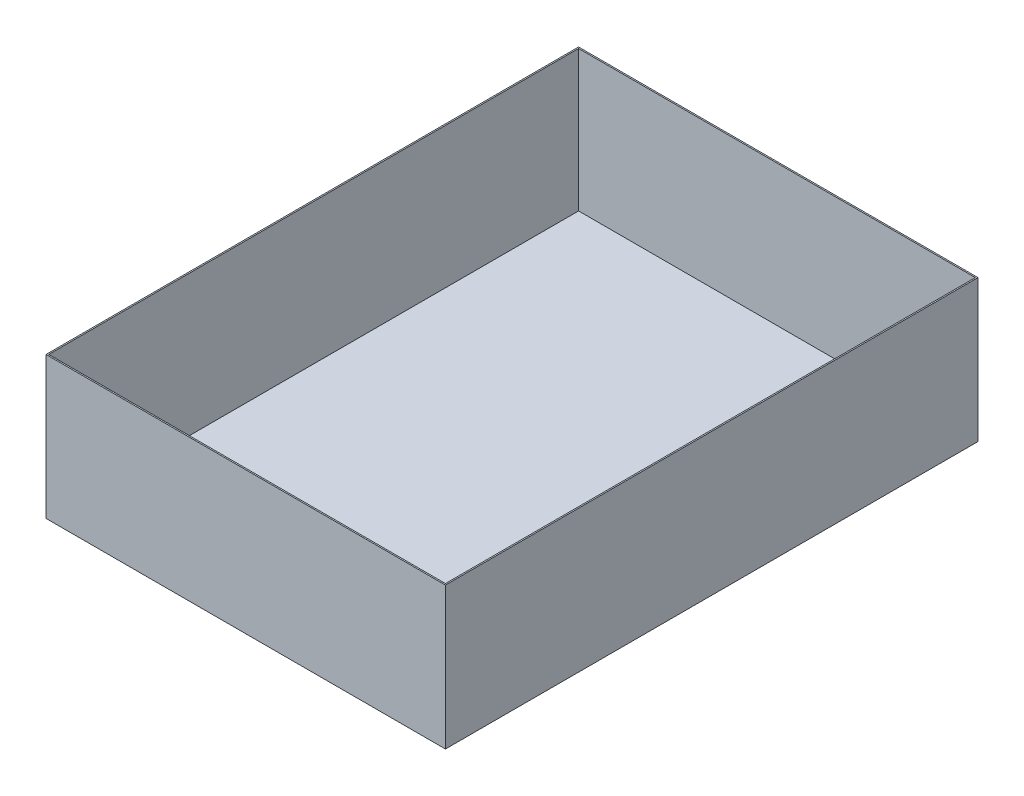
ISO-10303-21;
HEADER;
FILE_DESCRIPTION(('STEP AP214'),'2;1');
FILE_NAME('part.step','',(''),(''),'','','');
FILE_SCHEMA(('AUTOMOTIVE_DESIGN { 1 0 10303 214 1 1 1 1 }'));
ENDSEC;
DATA;
#1=APPLICATION_CONTEXT('core data for automotive mechanical design processes');
#2=APPLICATION_PROTOCOL_DEFINITION('international standard','automotive_design',2000,#1);
#3=PRODUCT_CONTEXT('',#1,'mechanical');
#4=PRODUCT('Part','Part','',(#3));
#5=PRODUCT_RELATED_PRODUCT_CATEGORY('part','',(#4));
#6=PRODUCT_DEFINITION_FORMATION('','',#4);
#7=PRODUCT_DEFINITION_CONTEXT('part definition',#1,'design');
#8=PRODUCT_DEFINITION('design','',#6,#7);
#9=PRODUCT_DEFINITION_SHAPE('','',#8);
#10=(LENGTH_UNIT() NAMED_UNIT(*) SI_UNIT(.MILLI.,.METRE.));
#11=(NAMED_UNIT(*) PLANE_ANGLE_UNIT() SI_UNIT($,.RADIAN.));
#12=(NAMED_UNIT(*) SI_UNIT($,.STERADIAN.) SOLID_ANGLE_UNIT());
#13=UNCERTAINTY_MEASURE_WITH_UNIT(LENGTH_MEASURE(1.E-05),#10,'distance_accuracy_value','');
#14=(GEOMETRIC_REPRESENTATION_CONTEXT(3) GLOBAL_UNCERTAINTY_ASSIGNED_CONTEXT((#13)) GLOBAL_UNIT_ASSIGNED_CONTEXT((#10,
#11,#12)) REPRESENTATION_CONTEXT('',''));
#15=CARTESIAN_POINT('',(0.,0.,0.));
#16=DIRECTION('',(0.,0.,1.));
#17=DIRECTION('',(1.,0.,0.));
#18=AXIS2_PLACEMENT_3D('',#15,#16,#17);
#19=CARTESIAN_POINT('',(0.,160.,0.));
#20=DIRECTION('',(1.,0.,0.));
#21=DIRECTION('',(0.,0.,-1.));
#22=AXIS2_PLACEMENT_3D('',#19,#20,#21);
#23=PLANE('',#22);
#24=DIRECTION('',(0.,0.,1.));
#25=VECTOR('',#24,1.);
#26=CARTESIAN_POINT('',(0.,0.,0.));
#27=LINE('',#26,#25);
#28=CARTESIAN_POINT('',(0.,0.,-600.));
#29=VERTEX_POINT('',#28);
#30=CARTESIAN_POINT('',(0.,0.,0.));
#31=VERTEX_POINT('',#30);
#32=EDGE_CURVE('E162',#29,#31,#27,.T.);
#33=ORIENTED_EDGE('',*,*,#32,.T.);
#34=DIRECTION('',(0.,-1.,0.));
#35=VECTOR('',#34,1.);
#36=CARTESIAN_POINT('',(0.,160.,0.));
#37=LINE('',#36,#35);
#38=CARTESIAN_POINT('',(0.,160.,0.));
#39=VERTEX_POINT('',#38);
#40=EDGE_CURVE('E12',#39,#31,#37,.T.);
#41=ORIENTED_EDGE('',*,*,#40,.F.);
#42=DIRECTION('',(0.,0.,1.));
#43=VECTOR('',#42,1.);
#44=CARTESIAN_POINT('',(0.,160.,0.));
#45=LINE('',#44,#43);
#46=CARTESIAN_POINT('',(0.,160.,-600.));
#47=VERTEX_POINT('',#46);
#48=EDGE_CURVE('E163',#47,#39,#45,.T.);
#49=ORIENTED_EDGE('',*,*,#48,.F.);
#50=DIRECTION('',(0.,-1.,0.));
#51=VECTOR('',#50,1.);
#52=CARTESIAN_POINT('',(0.,160.,-600.));
#53=LINE('',#52,#51);
#54=EDGE_CURVE('E173',#47,#29,#53,.T.);
#55=ORIENTED_EDGE('',*,*,#54,.T.);
#56=EDGE_LOOP('',(#33,#41,#49,#55));
#57=FACE_BOUND('',#56,.T.);
#58=ADVANCED_FACE('F41',(#57),#23,.F.);
#59=CARTESIAN_POINT('',(0.,160.,0.));
#60=DIRECTION('',(0.,0.,-1.));
#61=DIRECTION('',(-1.,0.,0.));
#62=AXIS2_PLACEMENT_3D('',#59,#60,#61);
#63=PLANE('',#62);
#64=DIRECTION('',(1.,0.,0.));
#65=VECTOR('',#64,1.);
#66=CARTESIAN_POINT('',(0.,0.,0.));
#67=LINE('',#66,#65);
#68=CARTESIAN_POINT('',(450.,0.,0.));
#69=VERTEX_POINT('',#68);
#70=EDGE_CURVE('E177',#31,#69,#67,.T.);
#71=ORIENTED_EDGE('',*,*,#70,.T.);
#72=DIRECTION('',(0.,-1.,0.));
#73=VECTOR('',#72,1.);
#74=CARTESIAN_POINT('',(450.,160.,0.));
#75=LINE('',#74,#73);
#76=CARTESIAN_POINT('',(450.,160.,0.));
#77=VERTEX_POINT('',#76);
#78=EDGE_CURVE('E49',#77,#69,#75,.T.);
#79=ORIENTED_EDGE('',*,*,#78,.F.);
#80=DIRECTION('',(1.,0.,0.));
#81=VECTOR('',#80,1.);
#82=CARTESIAN_POINT('',(0.,160.,0.));
#83=LINE('',#82,#81);
#84=EDGE_CURVE('E93',#39,#77,#83,.T.);
#85=ORIENTED_EDGE('',*,*,#84,.F.);
#86=ORIENTED_EDGE('',*,*,#40,.T.);
#87=EDGE_LOOP('',(#71,#79,#85,#86));
#88=FACE_BOUND('',#87,.T.);
#89=ADVANCED_FACE('F212',(#88),#63,.F.);
#90=CARTESIAN_POINT('',(450.,160.,0.));
#91=DIRECTION('',(-1.,0.,0.));
#92=DIRECTION('',(0.,0.,1.));
#93=AXIS2_PLACEMENT_3D('',#90,#91,#92);
#94=PLANE('',#93);
#95=DIRECTION('',(0.,0.,-1.));
#96=VECTOR('',#95,1.);
#97=CARTESIAN_POINT('',(450.,0.,0.));
#98=LINE('',#97,#96);
#99=CARTESIAN_POINT('',(450.,0.,-600.));
#100=VERTEX_POINT('',#99);
#101=EDGE_CURVE('E180',#69,#100,#98,.T.);
#102=ORIENTED_EDGE('',*,*,#101,.T.);
#103=DIRECTION('',(0.,-1.,0.));
#104=VECTOR('',#103,1.);
#105=CARTESIAN_POINT('',(450.,160.,-600.));
#106=LINE('',#105,#104);
#107=CARTESIAN_POINT('',(450.,160.,-600.));
#108=VERTEX_POINT('',#107);
#109=EDGE_CURVE('E187',#108,#100,#106,.T.);
#110=ORIENTED_EDGE('',*,*,#109,.F.);
#111=DIRECTION('',(0.,0.,-1.));
#112=VECTOR('',#111,1.);
#113=CARTESIAN_POINT('',(450.,160.,0.));
#114=LINE('',#113,#112);
#115=EDGE_CURVE('E168',#77,#108,#114,.T.);
#116=ORIENTED_EDGE('',*,*,#115,.F.);
#117=ORIENTED_EDGE('',*,*,#78,.T.);
#118=EDGE_LOOP('',(#102,#110,#116,#117));
#119=FACE_BOUND('',#118,.T.);
#120=ADVANCED_FACE('F194',(#119),#94,.F.);
#121=CARTESIAN_POINT('',(0.,160.,-600.));
#122=DIRECTION('',(0.,0.,1.));
#123=DIRECTION('',(1.,0.,0.));
#124=AXIS2_PLACEMENT_3D('',#121,#122,#123);
#125=PLANE('',#124);
#126=DIRECTION('',(-1.,0.,0.));
#127=VECTOR('',#126,1.);
#128=CARTESIAN_POINT('',(0.,0.,-600.));
#129=LINE('',#128,#127);
#130=EDGE_CURVE('E86',#100,#29,#129,.T.);
#131=ORIENTED_EDGE('',*,*,#130,.T.);
#132=ORIENTED_EDGE('',*,*,#54,.F.);
#133=DIRECTION('',(-1.,0.,0.));
#134=VECTOR('',#133,1.);
#135=CARTESIAN_POINT('',(0.,160.,-600.));
#136=LINE('',#135,#134);
#137=EDGE_CURVE('E65',#108,#47,#136,.T.);
#138=ORIENTED_EDGE('',*,*,#137,.F.);
#139=ORIENTED_EDGE('',*,*,#109,.T.);
#140=EDGE_LOOP('',(#131,#132,#138,#139));
#141=FACE_BOUND('',#140,.T.);
#142=ADVANCED_FACE('F202',(#141),#125,.F.);
#143=CARTESIAN_POINT('',(0.,160.,0.));
#144=DIRECTION('',(0.,-1.,0.));
#145=DIRECTION('',(0.,0.,-1.));
#146=AXIS2_PLACEMENT_3D('',#143,#144,#145);
#147=PLANE('',#146);
#148=DIRECTION('',(0.,0.,1.));
#149=VECTOR('',#148,1.);
#150=CARTESIAN_POINT('',(1.50000000000007,160.,0.));
#151=LINE('',#150,#149);
#152=CARTESIAN_POINT('',(1.5,160.,-598.5));
#153=VERTEX_POINT('',#152);
#154=CARTESIAN_POINT('',(1.50000000000007,160.,-1.5));
#155=VERTEX_POINT('',#154);
#156=EDGE_CURVE('E143',#153,#155,#151,.T.);
#157=ORIENTED_EDGE('',*,*,#156,.F.);
#158=DIRECTION('',(-1.,0.,0.));
#159=VECTOR('',#158,1.);
#160=CARTESIAN_POINT('',(-1.48650666719945E-13,160.,-598.5));
#161=LINE('',#160,#159);
#162=CARTESIAN_POINT('',(448.5,160.,-598.5));
#163=VERTEX_POINT('',#162);
#164=EDGE_CURVE('E133',#163,#153,#161,.T.);
#165=ORIENTED_EDGE('',*,*,#164,.F.);
#166=DIRECTION('',(0.,0.,-1.));
#167=VECTOR('',#166,1.);
#168=CARTESIAN_POINT('',(448.5,160.,0.));
#169=LINE('',#168,#167);
#170=CARTESIAN_POINT('',(448.5,160.,-1.50000000000002));
#171=VERTEX_POINT('',#170);
#172=EDGE_CURVE('E147',#171,#163,#169,.T.);
#173=ORIENTED_EDGE('',*,*,#172,.F.);
#174=DIRECTION('',(1.,0.,0.));
#175=VECTOR('',#174,1.);
#176=CARTESIAN_POINT('',(0.,160.,-1.5));
#177=LINE('',#176,#175);
#178=EDGE_CURVE('E56',#155,#171,#177,.T.);
#179=ORIENTED_EDGE('',*,*,#178,.F.);
#180=EDGE_LOOP('',(#157,#165,#173,#179));
#181=FACE_BOUND('',#180,.T.);
#182=ORIENTED_EDGE('',*,*,#48,.T.);
#183=ORIENTED_EDGE('',*,*,#84,.T.);
#184=ORIENTED_EDGE('',*,*,#115,.T.);
#185=ORIENTED_EDGE('',*,*,#137,.T.);
#186=EDGE_LOOP('',(#182,#183,#184,#185));
#187=FACE_BOUND('',#186,.T.);
#188=ADVANCED_FACE('F204',(#181,#187),#147,.F.);
#189=CARTESIAN_POINT('',(0.,0.,0.));
#190=DIRECTION('',(0.,-1.,0.));
#191=DIRECTION('',(0.,0.,-1.));
#192=AXIS2_PLACEMENT_3D('',#189,#190,#191);
#193=PLANE('',#192);
#194=ORIENTED_EDGE('',*,*,#32,.F.);
#195=ORIENTED_EDGE('',*,*,#130,.F.);
#196=ORIENTED_EDGE('',*,*,#101,.F.);
#197=ORIENTED_EDGE('',*,*,#70,.F.);
#198=EDGE_LOOP('',(#194,#195,#196,#197));
#199=FACE_BOUND('',#198,.T.);
#200=ADVANCED_FACE('F198',(#199),#193,.T.);
#201=CARTESIAN_POINT('',(0.,1.5,0.));
#202=DIRECTION('',(0.,-1.,0.));
#203=DIRECTION('',(0.,0.,-1.));
#204=AXIS2_PLACEMENT_3D('',#201,#202,#203);
#205=PLANE('',#204);
#206=DIRECTION('',(0.,0.,-1.));
#207=VECTOR('',#206,1.);
#208=CARTESIAN_POINT('',(448.5,1.49999999999995,0.));
#209=LINE('',#208,#207);
#210=CARTESIAN_POINT('',(448.5,1.49999999999995,-1.50000000000002));
#211=VERTEX_POINT('',#210);
#212=CARTESIAN_POINT('',(448.5,1.49999999999995,-598.5));
#213=VERTEX_POINT('',#212);
#214=EDGE_CURVE('E138',#211,#213,#209,.T.);
#215=ORIENTED_EDGE('',*,*,#214,.T.);
#216=DIRECTION('',(-1.,0.,0.));
#217=VECTOR('',#216,1.);
#218=CARTESIAN_POINT('',(-1.48650666719945E-13,1.49999999999995,-598.5));
#219=LINE('',#218,#217);
#220=CARTESIAN_POINT('',(1.5,1.49999999999995,-598.5));
#221=VERTEX_POINT('',#220);
#222=EDGE_CURVE('E130',#213,#221,#219,.T.);
#223=ORIENTED_EDGE('',*,*,#222,.T.);
#224=DIRECTION('',(0.,0.,1.));
#225=VECTOR('',#224,1.);
#226=CARTESIAN_POINT('',(1.50000000000007,1.49999999999995,0.));
#227=LINE('',#226,#225);
#228=CARTESIAN_POINT('',(1.50000000000007,1.49999999999995,-1.5));
#229=VERTEX_POINT('',#228);
#230=EDGE_CURVE('E116',#221,#229,#227,.T.);
#231=ORIENTED_EDGE('',*,*,#230,.T.);
#232=DIRECTION('',(1.,0.,0.));
#233=VECTOR('',#232,1.);
#234=CARTESIAN_POINT('',(0.,1.49999999999995,-1.5));
#235=LINE('',#234,#233);
#236=EDGE_CURVE('E153',#229,#211,#235,.T.);
#237=ORIENTED_EDGE('',*,*,#236,.T.);
#238=EDGE_LOOP('',(#215,#223,#231,#237));
#239=FACE_BOUND('',#238,.T.);
#240=ADVANCED_FACE('F137',(#239),#205,.F.);
#241=CARTESIAN_POINT('',(-1.48650666719945E-13,-745.80024135153,-598.5));
#242=DIRECTION('',(0.,0.,-1.));
#243=DIRECTION('',(-1.,0.,0.));
#244=AXIS2_PLACEMENT_3D('',#241,#242,#243);
#245=PLANE('',#244);
#246=DIRECTION('',(0.,1.,0.));
#247=VECTOR('',#246,1.);
#248=CARTESIAN_POINT('',(448.5,-745.80024135153,-598.5));
#249=LINE('',#248,#247);
#250=EDGE_CURVE('E151',#213,#163,#249,.T.);
#251=ORIENTED_EDGE('',*,*,#250,.T.);
#252=ORIENTED_EDGE('',*,*,#164,.T.);
#253=DIRECTION('',(0.,1.,0.));
#254=VECTOR('',#253,1.);
#255=CARTESIAN_POINT('',(1.5,-745.80024135153,-598.5));
#256=LINE('',#255,#254);
#257=EDGE_CURVE('E120',#221,#153,#256,.T.);
#258=ORIENTED_EDGE('',*,*,#257,.F.);
#259=ORIENTED_EDGE('',*,*,#222,.F.);
#260=EDGE_LOOP('',(#251,#252,#258,#259));
#261=FACE_BOUND('',#260,.T.);
#262=ADVANCED_FACE('F129',(#261),#245,.F.);
#263=CARTESIAN_POINT('',(1.50000000000007,-745.80024135153,0.));
#264=DIRECTION('',(-1.,0.,0.));
#265=DIRECTION('',(0.,0.,1.));
#266=AXIS2_PLACEMENT_3D('',#263,#264,#265);
#267=PLANE('',#266);
#268=ORIENTED_EDGE('',*,*,#257,.T.);
#269=ORIENTED_EDGE('',*,*,#156,.T.);
#270=DIRECTION('',(0.,1.,0.));
#271=VECTOR('',#270,1.);
#272=CARTESIAN_POINT('',(1.50000000000007,-745.80024135153,-1.5));
#273=LINE('',#272,#271);
#274=EDGE_CURVE('E122',#229,#155,#273,.T.);
#275=ORIENTED_EDGE('',*,*,#274,.F.);
#276=ORIENTED_EDGE('',*,*,#230,.F.);
#277=EDGE_LOOP('',(#268,#269,#275,#276));
#278=FACE_BOUND('',#277,.T.);
#279=ADVANCED_FACE('F118',(#278),#267,.F.);
#280=CARTESIAN_POINT('',(0.,-745.80024135153,-1.5));
#281=DIRECTION('',(0.,0.,1.));
#282=DIRECTION('',(1.,0.,0.));
#283=AXIS2_PLACEMENT_3D('',#280,#281,#282);
#284=PLANE('',#283);
#285=ORIENTED_EDGE('',*,*,#274,.T.);
#286=ORIENTED_EDGE('',*,*,#178,.T.);
#287=DIRECTION('',(0.,1.,0.));
#288=VECTOR('',#287,1.);
#289=CARTESIAN_POINT('',(448.5,-745.80024135153,-1.50000000000002));
#290=LINE('',#289,#288);
#291=EDGE_CURVE('E152',#211,#171,#290,.T.);
#292=ORIENTED_EDGE('',*,*,#291,.F.);
#293=ORIENTED_EDGE('',*,*,#236,.F.);
#294=EDGE_LOOP('',(#285,#286,#292,#293));
#295=FACE_BOUND('',#294,.T.);
#296=ADVANCED_FACE('F267',(#295),#284,.F.);
#297=CARTESIAN_POINT('',(448.5,-745.80024135153,0.));
#298=DIRECTION('',(1.,0.,0.));
#299=DIRECTION('',(0.,0.,-1.));
#300=AXIS2_PLACEMENT_3D('',#297,#298,#299);
#301=PLANE('',#300);
#302=ORIENTED_EDGE('',*,*,#291,.T.);
#303=ORIENTED_EDGE('',*,*,#172,.T.);
#304=ORIENTED_EDGE('',*,*,#250,.F.);
#305=ORIENTED_EDGE('',*,*,#214,.F.);
#306=EDGE_LOOP('',(#302,#303,#304,#305));
#307=FACE_BOUND('',#306,.T.);
#308=ADVANCED_FACE('F276',(#307),#301,.F.);
#309=CLOSED_SHELL('',(#58,#89,#120,#142,#188,#200,#240,#262,#279,#296,#308));
#310=MANIFOLD_SOLID_BREP('B2',#309);
#311=ADVANCED_BREP_SHAPE_REPRESENTATION('',(#18,#310),#14);
#312=SHAPE_DEFINITION_REPRESENTATION(#9,#311);
ENDSEC;
END-ISO-10303-21;
